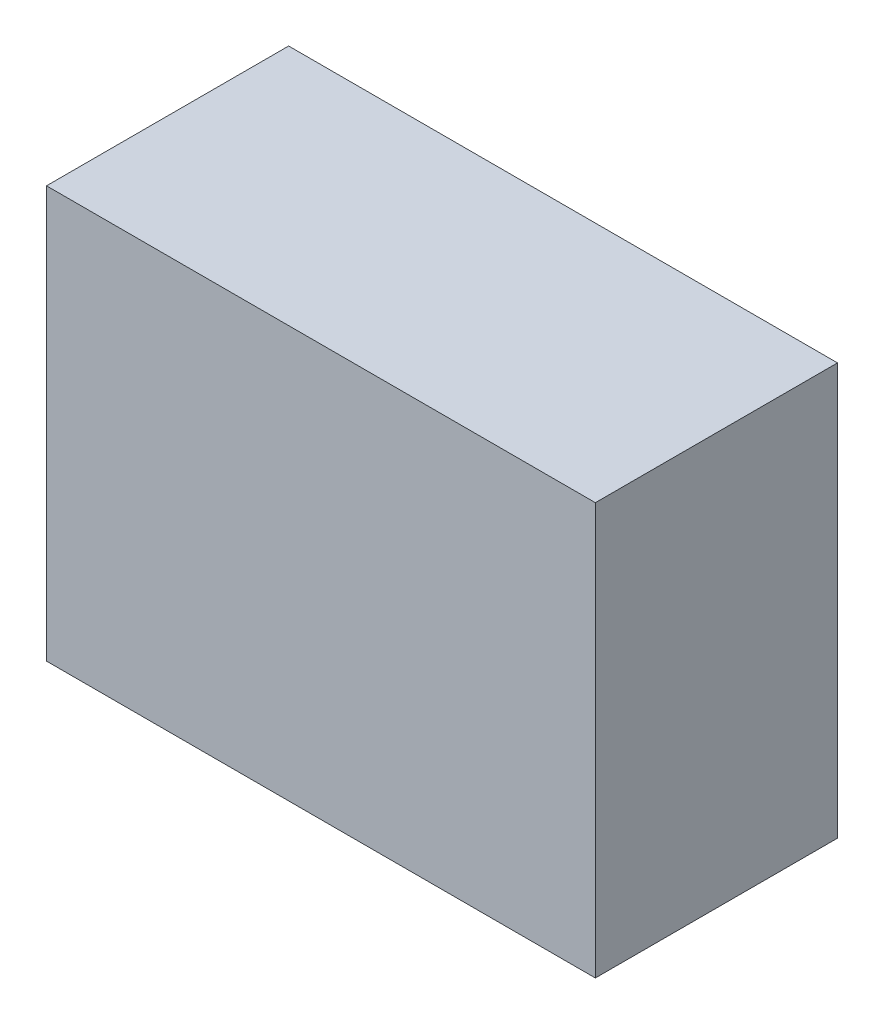
ISO-10303-21;
HEADER;
FILE_DESCRIPTION(('STEP AP214'),'2;1');
FILE_NAME('part.step','',(''),(''),'','','');
FILE_SCHEMA(('AUTOMOTIVE_DESIGN { 1 0 10303 214 1 1 1 1 }'));
ENDSEC;
DATA;
#1=APPLICATION_CONTEXT('core data for automotive mechanical design processes');
#2=APPLICATION_PROTOCOL_DEFINITION('international standard','automotive_design',2000,#1);
#3=PRODUCT_CONTEXT('',#1,'mechanical');
#4=PRODUCT('Part','Part','',(#3));
#5=PRODUCT_RELATED_PRODUCT_CATEGORY('part','',(#4));
#6=PRODUCT_DEFINITION_FORMATION('','',#4);
#7=PRODUCT_DEFINITION_CONTEXT('part definition',#1,'design');
#8=PRODUCT_DEFINITION('design','',#6,#7);
#9=PRODUCT_DEFINITION_SHAPE('','',#8);
#10=(LENGTH_UNIT() NAMED_UNIT(*) SI_UNIT(.MILLI.,.METRE.));
#11=(NAMED_UNIT(*) PLANE_ANGLE_UNIT() SI_UNIT($,.RADIAN.));
#12=(NAMED_UNIT(*) SI_UNIT($,.STERADIAN.) SOLID_ANGLE_UNIT());
#13=UNCERTAINTY_MEASURE_WITH_UNIT(LENGTH_MEASURE(1.E-05),#10,'distance_accuracy_value','');
#14=(GEOMETRIC_REPRESENTATION_CONTEXT(3) GLOBAL_UNCERTAINTY_ASSIGNED_CONTEXT((#13)) GLOBAL_UNIT_ASSIGNED_CONTEXT((#10,
#11,#12)) REPRESENTATION_CONTEXT('',''));
#15=CARTESIAN_POINT('',(0.,0.,0.));
#16=DIRECTION('',(0.,0.,1.));
#17=DIRECTION('',(1.,0.,0.));
#18=AXIS2_PLACEMENT_3D('',#15,#16,#17);
#19=CARTESIAN_POINT('',(-4.318,5.207,0.));
#20=DIRECTION('',(0.,0.,-1.));
#21=DIRECTION('',(-1.,0.,0.));
#22=AXIS2_PLACEMENT_3D('',#19,#20,#21);
#23=PLANE('',#22);
#24=DIRECTION('',(0.,1.,0.));
#25=VECTOR('',#24,1.);
#26=CARTESIAN_POINT('',(4.318,5.207,0.));
#27=LINE('',#26,#25);
#28=CARTESIAN_POINT('',(4.318,-1.27,0.));
#29=VERTEX_POINT('',#28);
#30=CARTESIAN_POINT('',(4.318,5.207,0.));
#31=VERTEX_POINT('',#30);
#32=EDGE_CURVE('E54',#29,#31,#27,.T.);
#33=ORIENTED_EDGE('',*,*,#32,.F.);
#34=DIRECTION('',(1.,0.,0.));
#35=VECTOR('',#34,1.);
#36=CARTESIAN_POINT('',(4.318,-1.27,0.));
#37=LINE('',#36,#35);
#38=CARTESIAN_POINT('',(-4.318,-1.27,0.));
#39=VERTEX_POINT('',#38);
#40=EDGE_CURVE('E19',#39,#29,#37,.T.);
#41=ORIENTED_EDGE('',*,*,#40,.F.);
#42=DIRECTION('',(0.,1.,0.));
#43=VECTOR('',#42,1.);
#44=CARTESIAN_POINT('',(-4.318,-1.27,0.));
#45=LINE('',#44,#43);
#46=CARTESIAN_POINT('',(-4.318,5.207,0.));
#47=VERTEX_POINT('',#46);
#48=EDGE_CURVE('E79',#47,#39,#45,.F.);
#49=ORIENTED_EDGE('',*,*,#48,.F.);
#50=DIRECTION('',(1.,0.,0.));
#51=VECTOR('',#50,1.);
#52=CARTESIAN_POINT('',(-4.318,5.207,0.));
#53=LINE('',#52,#51);
#54=EDGE_CURVE('E67',#31,#47,#53,.F.);
#55=ORIENTED_EDGE('',*,*,#54,.F.);
#56=EDGE_LOOP('',(#33,#41,#49,#55));
#57=FACE_BOUND('',#56,.T.);
#58=ADVANCED_FACE('F16',(#57),#23,.T.);
#59=CARTESIAN_POINT('',(4.318,-1.27,3.81));
#60=DIRECTION('',(0.,-1.,0.));
#61=DIRECTION('',(0.,0.,-1.));
#62=AXIS2_PLACEMENT_3D('',#59,#60,#61);
#63=PLANE('',#62);
#64=ORIENTED_EDGE('',*,*,#40,.T.);
#65=DIRECTION('',(0.,0.,-1.));
#66=VECTOR('',#65,1.);
#67=CARTESIAN_POINT('',(4.318,-1.27,3.81));
#68=LINE('',#67,#66);
#69=CARTESIAN_POINT('',(4.318,-1.27,3.81));
#70=VERTEX_POINT('',#69);
#71=EDGE_CURVE('E60',#70,#29,#68,.T.);
#72=ORIENTED_EDGE('',*,*,#71,.F.);
#73=DIRECTION('',(1.,0.,0.));
#74=VECTOR('',#73,1.);
#75=CARTESIAN_POINT('',(-4.318,-1.27,3.81));
#76=LINE('',#75,#74);
#77=CARTESIAN_POINT('',(-4.318,-1.27,3.81));
#78=VERTEX_POINT('',#77);
#79=EDGE_CURVE('E82',#78,#70,#76,.T.);
#80=ORIENTED_EDGE('',*,*,#79,.F.);
#81=DIRECTION('',(0.,0.,1.));
#82=VECTOR('',#81,1.);
#83=CARTESIAN_POINT('',(-4.318,-1.27,3.81));
#84=LINE('',#83,#82);
#85=EDGE_CURVE('E63',#39,#78,#84,.T.);
#86=ORIENTED_EDGE('',*,*,#85,.F.);
#87=EDGE_LOOP('',(#64,#72,#80,#86));
#88=FACE_BOUND('',#87,.T.);
#89=ADVANCED_FACE('F59',(#88),#63,.T.);
#90=CARTESIAN_POINT('',(4.318,5.207,3.81));
#91=DIRECTION('',(1.,0.,0.));
#92=DIRECTION('',(0.,0.,-1.));
#93=AXIS2_PLACEMENT_3D('',#90,#91,#92);
#94=PLANE('',#93);
#95=ORIENTED_EDGE('',*,*,#32,.T.);
#96=DIRECTION('',(0.,0.,1.));
#97=VECTOR('',#96,1.);
#98=CARTESIAN_POINT('',(4.318,5.207,3.81));
#99=LINE('',#98,#97);
#100=CARTESIAN_POINT('',(4.318,5.207,3.81));
#101=VERTEX_POINT('',#100);
#102=EDGE_CURVE('E69',#101,#31,#99,.F.);
#103=ORIENTED_EDGE('',*,*,#102,.F.);
#104=DIRECTION('',(0.,1.,0.));
#105=VECTOR('',#104,1.);
#106=CARTESIAN_POINT('',(4.318,5.207,3.81));
#107=LINE('',#106,#105);
#108=EDGE_CURVE('E73',#70,#101,#107,.T.);
#109=ORIENTED_EDGE('',*,*,#108,.F.);
#110=ORIENTED_EDGE('',*,*,#71,.T.);
#111=EDGE_LOOP('',(#95,#103,#109,#110));
#112=FACE_BOUND('',#111,.T.);
#113=ADVANCED_FACE('F71',(#112),#94,.T.);
#114=CARTESIAN_POINT('',(-4.318,5.207,3.81));
#115=DIRECTION('',(0.,1.,0.));
#116=DIRECTION('',(0.,0.,1.));
#117=AXIS2_PLACEMENT_3D('',#114,#115,#116);
#118=PLANE('',#117);
#119=ORIENTED_EDGE('',*,*,#54,.T.);
#120=DIRECTION('',(0.,0.,1.));
#121=VECTOR('',#120,1.);
#122=CARTESIAN_POINT('',(-4.318,5.207,3.81));
#123=LINE('',#122,#121);
#124=CARTESIAN_POINT('',(-4.318,5.207,3.81));
#125=VERTEX_POINT('',#124);
#126=EDGE_CURVE('E34',#125,#47,#123,.F.);
#127=ORIENTED_EDGE('',*,*,#126,.F.);
#128=DIRECTION('',(1.,0.,0.));
#129=VECTOR('',#128,1.);
#130=CARTESIAN_POINT('',(-4.318,5.207,3.81));
#131=LINE('',#130,#129);
#132=EDGE_CURVE('E25',#101,#125,#131,.F.);
#133=ORIENTED_EDGE('',*,*,#132,.F.);
#134=ORIENTED_EDGE('',*,*,#102,.T.);
#135=EDGE_LOOP('',(#119,#127,#133,#134));
#136=FACE_BOUND('',#135,.T.);
#137=ADVANCED_FACE('F88',(#136),#118,.T.);
#138=CARTESIAN_POINT('',(-4.318,-1.27,3.81));
#139=DIRECTION('',(-1.,0.,0.));
#140=DIRECTION('',(0.,0.,1.));
#141=AXIS2_PLACEMENT_3D('',#138,#139,#140);
#142=PLANE('',#141);
#143=ORIENTED_EDGE('',*,*,#48,.T.);
#144=ORIENTED_EDGE('',*,*,#85,.T.);
#145=DIRECTION('',(0.,1.,0.));
#146=VECTOR('',#145,1.);
#147=CARTESIAN_POINT('',(-4.318,5.207,3.81));
#148=LINE('',#147,#146);
#149=EDGE_CURVE('E11',#125,#78,#148,.F.);
#150=ORIENTED_EDGE('',*,*,#149,.F.);
#151=ORIENTED_EDGE('',*,*,#126,.T.);
#152=EDGE_LOOP('',(#143,#144,#150,#151));
#153=FACE_BOUND('',#152,.T.);
#154=ADVANCED_FACE('F90',(#153),#142,.T.);
#155=CARTESIAN_POINT('',(-4.318,5.207,3.81));
#156=DIRECTION('',(0.,0.,1.));
#157=DIRECTION('',(1.,0.,0.));
#158=AXIS2_PLACEMENT_3D('',#155,#156,#157);
#159=PLANE('',#158);
#160=ORIENTED_EDGE('',*,*,#132,.T.);
#161=ORIENTED_EDGE('',*,*,#149,.T.);
#162=ORIENTED_EDGE('',*,*,#79,.T.);
#163=ORIENTED_EDGE('',*,*,#108,.T.);
#164=EDGE_LOOP('',(#160,#161,#162,#163));
#165=FACE_BOUND('',#164,.T.);
#166=ADVANCED_FACE('F87',(#165),#159,.T.);
#167=CLOSED_SHELL('',(#58,#89,#113,#137,#154,#166));
#168=MANIFOLD_SOLID_BREP('B1',#167);
#169=ADVANCED_BREP_SHAPE_REPRESENTATION('',(#18,#168),#14);
#170=SHAPE_DEFINITION_REPRESENTATION(#9,#169);
ENDSEC;
END-ISO-10303-21;
